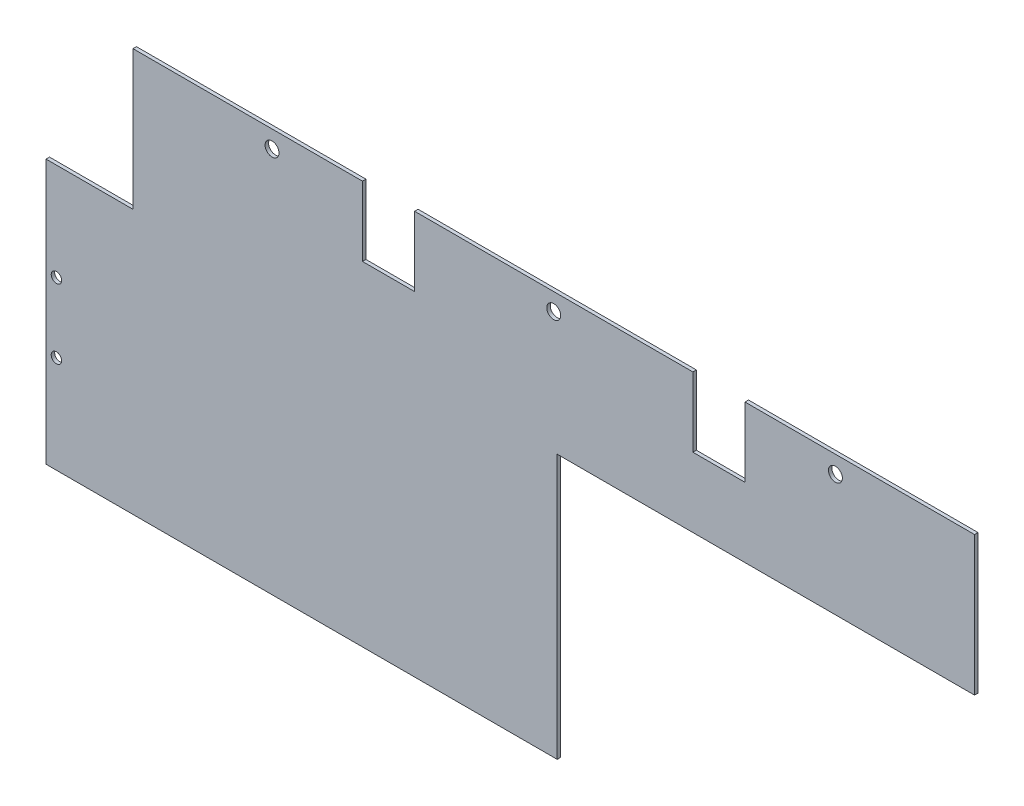
ISO-10303-21;
HEADER;
FILE_DESCRIPTION(('STEP AP214'),'2;1');
FILE_NAME('part.step','',(''),(''),'','','');
FILE_SCHEMA(('AUTOMOTIVE_DESIGN { 1 0 10303 214 1 1 1 1 }'));
ENDSEC;
DATA;
#1=APPLICATION_CONTEXT('core data for automotive mechanical design processes');
#2=APPLICATION_PROTOCOL_DEFINITION('international standard','automotive_design',2000,#1);
#3=PRODUCT_CONTEXT('',#1,'mechanical');
#4=PRODUCT('Part','Part','',(#3));
#5=PRODUCT_RELATED_PRODUCT_CATEGORY('part','',(#4));
#6=PRODUCT_DEFINITION_FORMATION('','',#4);
#7=PRODUCT_DEFINITION_CONTEXT('part definition',#1,'design');
#8=PRODUCT_DEFINITION('design','',#6,#7);
#9=PRODUCT_DEFINITION_SHAPE('','',#8);
#10=(LENGTH_UNIT() NAMED_UNIT(*) SI_UNIT(.MILLI.,.METRE.));
#11=(NAMED_UNIT(*) PLANE_ANGLE_UNIT() SI_UNIT($,.RADIAN.));
#12=(NAMED_UNIT(*) SI_UNIT($,.STERADIAN.) SOLID_ANGLE_UNIT());
#13=UNCERTAINTY_MEASURE_WITH_UNIT(LENGTH_MEASURE(1.E-05),#10,'distance_accuracy_value','');
#14=(GEOMETRIC_REPRESENTATION_CONTEXT(3) GLOBAL_UNCERTAINTY_ASSIGNED_CONTEXT((#13)) GLOBAL_UNIT_ASSIGNED_CONTEXT((#10,
#11,#12)) REPRESENTATION_CONTEXT('',''));
#15=CARTESIAN_POINT('',(0.,0.,0.));
#16=DIRECTION('',(0.,0.,1.));
#17=DIRECTION('',(1.,0.,0.));
#18=AXIS2_PLACEMENT_3D('',#15,#16,#17);
#19=CARTESIAN_POINT('',(25.,116.,1.));
#20=DIRECTION('',(0.,-1.,0.));
#21=DIRECTION('',(0.,0.,-1.));
#22=AXIS2_PLACEMENT_3D('',#19,#20,#21);
#23=PLANE('',#22);
#24=DIRECTION('',(-1.,0.,0.));
#25=VECTOR('',#24,1.);
#26=CARTESIAN_POINT('',(25.,116.,0.));
#27=LINE('',#26,#25);
#28=CARTESIAN_POINT('',(267.,116.,0.));
#29=VERTEX_POINT('',#28);
#30=CARTESIAN_POINT('',(201.,116.,0.));
#31=VERTEX_POINT('',#30);
#32=EDGE_CURVE('E282',#29,#31,#27,.T.);
#33=ORIENTED_EDGE('',*,*,#32,.T.);
#34=DIRECTION('',(0.,0.,1.));
#35=VECTOR('',#34,1.);
#36=CARTESIAN_POINT('',(201.,116.,0.));
#37=LINE('',#36,#35);
#38=CARTESIAN_POINT('',(201.,116.,1.));
#39=VERTEX_POINT('',#38);
#40=EDGE_CURVE('E212',#31,#39,#37,.T.);
#41=ORIENTED_EDGE('',*,*,#40,.T.);
#42=DIRECTION('',(-1.,0.,0.));
#43=VECTOR('',#42,1.);
#44=CARTESIAN_POINT('',(25.,116.,1.));
#45=LINE('',#44,#43);
#46=CARTESIAN_POINT('',(267.,116.,1.));
#47=VERTEX_POINT('',#46);
#48=EDGE_CURVE('E268',#47,#39,#45,.T.);
#49=ORIENTED_EDGE('',*,*,#48,.F.);
#50=DIRECTION('',(0.,0.,-1.));
#51=VECTOR('',#50,1.);
#52=CARTESIAN_POINT('',(267.,116.,1.));
#53=LINE('',#52,#51);
#54=EDGE_CURVE('E48',#47,#29,#53,.T.);
#55=ORIENTED_EDGE('',*,*,#54,.T.);
#56=EDGE_LOOP('',(#33,#41,#49,#55));
#57=FACE_BOUND('',#56,.T.);
#58=ADVANCED_FACE('F40',(#57),#23,.F.);
#59=CARTESIAN_POINT('',(91.,116.,1.));
#60=VERTEX_POINT('',#59);
#61=CARTESIAN_POINT('',(25.,116.,1.));
#62=VERTEX_POINT('',#61);
#63=EDGE_CURVE('E267',#60,#62,#45,.T.);
#64=ORIENTED_EDGE('',*,*,#63,.F.);
#65=DIRECTION('',(0.,0.,1.));
#66=VECTOR('',#65,1.);
#67=CARTESIAN_POINT('',(91.,116.,0.));
#68=LINE('',#67,#66);
#69=CARTESIAN_POINT('',(91.,116.,0.));
#70=VERTEX_POINT('',#69);
#71=EDGE_CURVE('E241',#70,#60,#68,.T.);
#72=ORIENTED_EDGE('',*,*,#71,.F.);
#73=CARTESIAN_POINT('',(25.,116.,0.));
#74=VERTEX_POINT('',#73);
#75=EDGE_CURVE('E281',#70,#74,#27,.T.);
#76=ORIENTED_EDGE('',*,*,#75,.T.);
#77=DIRECTION('',(0.,0.,-1.));
#78=VECTOR('',#77,1.);
#79=CARTESIAN_POINT('',(25.,116.,1.));
#80=LINE('',#79,#78);
#81=EDGE_CURVE('E299',#62,#74,#80,.T.);
#82=ORIENTED_EDGE('',*,*,#81,.F.);
#83=EDGE_LOOP('',(#64,#72,#76,#82));
#84=FACE_BOUND('',#83,.T.);
#85=ADVANCED_FACE('F327',(#84),#23,.F.);
#86=CARTESIAN_POINT('',(0.,0.,1.));
#87=DIRECTION('',(0.,0.,-1.));
#88=DIRECTION('',(-1.,0.,0.));
#89=AXIS2_PLACEMENT_3D('',#86,#87,#88);
#90=PLANE('',#89);
#91=CARTESIAN_POINT('',(65.,111.,1.));
#92=DIRECTION('',(0.,0.,1.));
#93=DIRECTION('',(1.,0.,0.));
#94=AXIS2_PLACEMENT_3D('',#91,#92,#93);
#95=CIRCLE('',#94,2.);
#96=CARTESIAN_POINT('',(67.,111.,1.));
#97=VERTEX_POINT('',#96);
#98=EDGE_CURVE('E186',#97,#97,#95,.T.);
#99=ORIENTED_EDGE('',*,*,#98,.F.);
#100=EDGE_LOOP('',(#99));
#101=FACE_BOUND('',#100,.T.);
#102=CARTESIAN_POINT('',(227.,111.,1.));
#103=DIRECTION('',(0.,0.,1.));
#104=DIRECTION('',(-1.,0.,0.));
#105=AXIS2_PLACEMENT_3D('',#102,#103,#104);
#106=CIRCLE('',#105,2.);
#107=CARTESIAN_POINT('',(225.,111.,1.));
#108=VERTEX_POINT('',#107);
#109=EDGE_CURVE('E187',#108,#108,#106,.T.);
#110=ORIENTED_EDGE('',*,*,#109,.F.);
#111=EDGE_LOOP('',(#110));
#112=FACE_BOUND('',#111,.T.);
#113=CARTESIAN_POINT('',(146.,111.,1.));
#114=DIRECTION('',(0.,0.,1.));
#115=DIRECTION('',(1.,0.,0.));
#116=AXIS2_PLACEMENT_3D('',#113,#114,#115);
#117=CIRCLE('',#116,2.);
#118=CARTESIAN_POINT('',(148.,111.,1.));
#119=VERTEX_POINT('',#118);
#120=EDGE_CURVE('E181',#119,#119,#117,.T.);
#121=ORIENTED_EDGE('',*,*,#120,.F.);
#122=EDGE_LOOP('',(#121));
#123=FACE_BOUND('',#122,.T.);
#124=DIRECTION('',(1.,0.,0.));
#125=VECTOR('',#124,1.);
#126=CARTESIAN_POINT('',(292.,0.,1.));
#127=LINE('',#126,#125);
#128=CARTESIAN_POINT('',(0.,0.,1.));
#129=VERTEX_POINT('',#128);
#130=CARTESIAN_POINT('',(147.,0.,1.));
#131=VERTEX_POINT('',#130);
#132=EDGE_CURVE('E261',#129,#131,#127,.T.);
#133=ORIENTED_EDGE('',*,*,#132,.T.);
#134=DIRECTION('',(0.,-1.,0.));
#135=VECTOR('',#134,1.);
#136=CARTESIAN_POINT('',(147.,0.,1.));
#137=LINE('',#136,#135);
#138=CARTESIAN_POINT('',(147.,76.,1.));
#139=VERTEX_POINT('',#138);
#140=EDGE_CURVE('E176',#139,#131,#137,.T.);
#141=ORIENTED_EDGE('',*,*,#140,.F.);
#142=DIRECTION('',(-1.,0.,0.));
#143=VECTOR('',#142,1.);
#144=CARTESIAN_POINT('',(292.,76.,1.));
#145=LINE('',#144,#143);
#146=CARTESIAN_POINT('',(267.,76.,1.));
#147=VERTEX_POINT('',#146);
#148=EDGE_CURVE('E158',#147,#139,#145,.T.);
#149=ORIENTED_EDGE('',*,*,#148,.F.);
#150=DIRECTION('',(0.,1.,0.));
#151=VECTOR('',#150,1.);
#152=CARTESIAN_POINT('',(267.,116.,1.));
#153=LINE('',#152,#151);
#154=EDGE_CURVE('E264',#147,#47,#153,.T.);
#155=ORIENTED_EDGE('',*,*,#154,.T.);
#156=ORIENTED_EDGE('',*,*,#48,.T.);
#157=DIRECTION('',(0.,1.,0.));
#158=VECTOR('',#157,1.);
#159=CARTESIAN_POINT('',(201.,116.,1.));
#160=LINE('',#159,#158);
#161=CARTESIAN_POINT('',(201.,96.,1.));
#162=VERTEX_POINT('',#161);
#163=EDGE_CURVE('E197',#162,#39,#160,.T.);
#164=ORIENTED_EDGE('',*,*,#163,.F.);
#165=DIRECTION('',(1.,0.,0.));
#166=VECTOR('',#165,1.);
#167=CARTESIAN_POINT('',(201.,96.,1.));
#168=LINE('',#167,#166);
#169=CARTESIAN_POINT('',(186.,96.,1.));
#170=VERTEX_POINT('',#169);
#171=EDGE_CURVE('E207',#170,#162,#168,.T.);
#172=ORIENTED_EDGE('',*,*,#171,.F.);
#173=DIRECTION('',(0.,-1.,0.));
#174=VECTOR('',#173,1.);
#175=CARTESIAN_POINT('',(186.,116.,1.));
#176=LINE('',#175,#174);
#177=CARTESIAN_POINT('',(186.,116.,1.));
#178=VERTEX_POINT('',#177);
#179=EDGE_CURVE('E204',#178,#170,#176,.T.);
#180=ORIENTED_EDGE('',*,*,#179,.F.);
#181=CARTESIAN_POINT('',(106.,116.,1.));
#182=VERTEX_POINT('',#181);
#183=EDGE_CURVE('E272',#178,#182,#45,.T.);
#184=ORIENTED_EDGE('',*,*,#183,.T.);
#185=DIRECTION('',(0.,1.,0.));
#186=VECTOR('',#185,1.);
#187=CARTESIAN_POINT('',(106.,116.,1.));
#188=LINE('',#187,#186);
#189=CARTESIAN_POINT('',(106.,96.,1.));
#190=VERTEX_POINT('',#189);
#191=EDGE_CURVE('E55',#190,#182,#188,.T.);
#192=ORIENTED_EDGE('',*,*,#191,.F.);
#193=DIRECTION('',(1.,0.,0.));
#194=VECTOR('',#193,1.);
#195=CARTESIAN_POINT('',(91.,96.,1.));
#196=LINE('',#195,#194);
#197=CARTESIAN_POINT('',(91.,96.,1.));
#198=VERTEX_POINT('',#197);
#199=EDGE_CURVE('E237',#198,#190,#196,.T.);
#200=ORIENTED_EDGE('',*,*,#199,.F.);
#201=DIRECTION('',(0.,-1.,0.));
#202=VECTOR('',#201,1.);
#203=CARTESIAN_POINT('',(91.,116.,1.));
#204=LINE('',#203,#202);
#205=EDGE_CURVE('E215',#60,#198,#204,.T.);
#206=ORIENTED_EDGE('',*,*,#205,.F.);
#207=ORIENTED_EDGE('',*,*,#63,.T.);
#208=DIRECTION('',(0.,-1.,0.));
#209=VECTOR('',#208,1.);
#210=CARTESIAN_POINT('',(25.,76.,1.));
#211=LINE('',#210,#209);
#212=CARTESIAN_POINT('',(25.,76.,1.));
#213=VERTEX_POINT('',#212);
#214=EDGE_CURVE('E271',#62,#213,#211,.T.);
#215=ORIENTED_EDGE('',*,*,#214,.T.);
#216=DIRECTION('',(-1.,0.,0.));
#217=VECTOR('',#216,1.);
#218=CARTESIAN_POINT('',(0.,76.,1.));
#219=LINE('',#218,#217);
#220=CARTESIAN_POINT('',(0.,76.,1.));
#221=VERTEX_POINT('',#220);
#222=EDGE_CURVE('E274',#213,#221,#219,.T.);
#223=ORIENTED_EDGE('',*,*,#222,.T.);
#224=DIRECTION('',(0.,-1.,0.));
#225=VECTOR('',#224,1.);
#226=CARTESIAN_POINT('',(0.,0.,1.));
#227=LINE('',#226,#225);
#228=EDGE_CURVE('E276',#221,#129,#227,.T.);
#229=ORIENTED_EDGE('',*,*,#228,.T.);
#230=EDGE_LOOP('',(#133,#141,#149,#155,#156,#164,#172,#180,#184,#192,#200,#206,#207,#215,#223,#229));
#231=FACE_BOUND('',#230,.T.);
#232=CARTESIAN_POINT('',(3.,48.,1.));
#233=DIRECTION('',(0.,0.,1.));
#234=DIRECTION('',(1.,0.,0.));
#235=AXIS2_PLACEMENT_3D('',#232,#233,#234);
#236=CIRCLE('',#235,1.5);
#237=CARTESIAN_POINT('',(4.5,48.,1.));
#238=VERTEX_POINT('',#237);
#239=EDGE_CURVE('E255',#238,#238,#236,.T.);
#240=ORIENTED_EDGE('',*,*,#239,.F.);
#241=EDGE_LOOP('',(#240));
#242=FACE_BOUND('',#241,.T.);
#243=CARTESIAN_POINT('',(3.,28.,1.));
#244=DIRECTION('',(0.,0.,1.));
#245=DIRECTION('',(1.,0.,0.));
#246=AXIS2_PLACEMENT_3D('',#243,#244,#245);
#247=CIRCLE('',#246,1.5);
#248=CARTESIAN_POINT('',(4.5,28.,1.));
#249=VERTEX_POINT('',#248);
#250=EDGE_CURVE('E249',#249,#249,#247,.T.);
#251=ORIENTED_EDGE('',*,*,#250,.F.);
#252=EDGE_LOOP('',(#251));
#253=FACE_BOUND('',#252,.T.);
#254=ADVANCED_FACE('F313',(#101,#112,#123,#231,#242,#253),#90,.F.);
#255=CARTESIAN_POINT('',(0.,0.,0.));
#256=DIRECTION('',(0.,0.,-1.));
#257=DIRECTION('',(-1.,0.,0.));
#258=AXIS2_PLACEMENT_3D('',#255,#256,#257);
#259=PLANE('',#258);
#260=DIRECTION('',(0.,-1.,0.));
#261=VECTOR('',#260,1.);
#262=CARTESIAN_POINT('',(147.,0.,0.));
#263=LINE('',#262,#261);
#264=CARTESIAN_POINT('',(147.,76.,0.));
#265=VERTEX_POINT('',#264);
#266=CARTESIAN_POINT('',(147.,0.,0.));
#267=VERTEX_POINT('',#266);
#268=EDGE_CURVE('E162',#265,#267,#263,.T.);
#269=ORIENTED_EDGE('',*,*,#268,.T.);
#270=DIRECTION('',(1.,0.,0.));
#271=VECTOR('',#270,1.);
#272=CARTESIAN_POINT('',(292.,0.,0.));
#273=LINE('',#272,#271);
#274=CARTESIAN_POINT('',(0.,0.,0.));
#275=VERTEX_POINT('',#274);
#276=EDGE_CURVE('E258',#275,#267,#273,.T.);
#277=ORIENTED_EDGE('',*,*,#276,.F.);
#278=DIRECTION('',(0.,-1.,0.));
#279=VECTOR('',#278,1.);
#280=CARTESIAN_POINT('',(0.,0.,0.));
#281=LINE('',#280,#279);
#282=CARTESIAN_POINT('',(0.,76.,0.));
#283=VERTEX_POINT('',#282);
#284=EDGE_CURVE('E265',#283,#275,#281,.T.);
#285=ORIENTED_EDGE('',*,*,#284,.F.);
#286=DIRECTION('',(-1.,0.,0.));
#287=VECTOR('',#286,1.);
#288=CARTESIAN_POINT('',(0.,76.,0.));
#289=LINE('',#288,#287);
#290=CARTESIAN_POINT('',(25.,76.,0.));
#291=VERTEX_POINT('',#290);
#292=EDGE_CURVE('E288',#291,#283,#289,.T.);
#293=ORIENTED_EDGE('',*,*,#292,.F.);
#294=DIRECTION('',(0.,-1.,0.));
#295=VECTOR('',#294,1.);
#296=CARTESIAN_POINT('',(25.,76.,0.));
#297=LINE('',#296,#295);
#298=EDGE_CURVE('E285',#74,#291,#297,.T.);
#299=ORIENTED_EDGE('',*,*,#298,.F.);
#300=ORIENTED_EDGE('',*,*,#75,.F.);
#301=DIRECTION('',(0.,-1.,0.));
#302=VECTOR('',#301,1.);
#303=CARTESIAN_POINT('',(91.,116.,0.));
#304=LINE('',#303,#302);
#305=CARTESIAN_POINT('',(91.,96.,0.));
#306=VERTEX_POINT('',#305);
#307=EDGE_CURVE('E225',#70,#306,#304,.T.);
#308=ORIENTED_EDGE('',*,*,#307,.T.);
#309=DIRECTION('',(1.,0.,0.));
#310=VECTOR('',#309,1.);
#311=CARTESIAN_POINT('',(91.,96.,0.));
#312=LINE('',#311,#310);
#313=CARTESIAN_POINT('',(106.,96.,0.));
#314=VERTEX_POINT('',#313);
#315=EDGE_CURVE('E228',#306,#314,#312,.T.);
#316=ORIENTED_EDGE('',*,*,#315,.T.);
#317=DIRECTION('',(0.,1.,0.));
#318=VECTOR('',#317,1.);
#319=CARTESIAN_POINT('',(106.,116.,0.));
#320=LINE('',#319,#318);
#321=CARTESIAN_POINT('',(106.,116.,0.));
#322=VERTEX_POINT('',#321);
#323=EDGE_CURVE('E231',#314,#322,#320,.T.);
#324=ORIENTED_EDGE('',*,*,#323,.T.);
#325=CARTESIAN_POINT('',(186.,116.,0.));
#326=VERTEX_POINT('',#325);
#327=EDGE_CURVE('E286',#326,#322,#27,.T.);
#328=ORIENTED_EDGE('',*,*,#327,.F.);
#329=DIRECTION('',(0.,-1.,0.));
#330=VECTOR('',#329,1.);
#331=CARTESIAN_POINT('',(186.,116.,0.));
#332=LINE('',#331,#330);
#333=CARTESIAN_POINT('',(186.,96.,0.));
#334=VERTEX_POINT('',#333);
#335=EDGE_CURVE('E63',#326,#334,#332,.T.);
#336=ORIENTED_EDGE('',*,*,#335,.T.);
#337=DIRECTION('',(1.,0.,0.));
#338=VECTOR('',#337,1.);
#339=CARTESIAN_POINT('',(201.,96.,0.));
#340=LINE('',#339,#338);
#341=CARTESIAN_POINT('',(201.,96.,0.));
#342=VERTEX_POINT('',#341);
#343=EDGE_CURVE('E196',#334,#342,#340,.T.);
#344=ORIENTED_EDGE('',*,*,#343,.T.);
#345=DIRECTION('',(0.,1.,0.));
#346=VECTOR('',#345,1.);
#347=CARTESIAN_POINT('',(201.,116.,0.));
#348=LINE('',#347,#346);
#349=EDGE_CURVE('E200',#342,#31,#348,.T.);
#350=ORIENTED_EDGE('',*,*,#349,.T.);
#351=ORIENTED_EDGE('',*,*,#32,.F.);
#352=DIRECTION('',(0.,1.,0.));
#353=VECTOR('',#352,1.);
#354=CARTESIAN_POINT('',(267.,116.,0.));
#355=LINE('',#354,#353);
#356=CARTESIAN_POINT('',(267.,76.,0.));
#357=VERTEX_POINT('',#356);
#358=EDGE_CURVE('E175',#357,#29,#355,.T.);
#359=ORIENTED_EDGE('',*,*,#358,.F.);
#360=DIRECTION('',(-1.,0.,0.));
#361=VECTOR('',#360,1.);
#362=CARTESIAN_POINT('',(292.,76.,0.));
#363=LINE('',#362,#361);
#364=EDGE_CURVE('E156',#357,#265,#363,.T.);
#365=ORIENTED_EDGE('',*,*,#364,.T.);
#366=EDGE_LOOP('',(#269,#277,#285,#293,#299,#300,#308,#316,#324,#328,#336,#344,#350,#351,#359,#365));
#367=FACE_BOUND('',#366,.T.);
#368=CARTESIAN_POINT('',(65.,111.,0.));
#369=DIRECTION('',(0.,0.,1.));
#370=DIRECTION('',(1.,0.,0.));
#371=AXIS2_PLACEMENT_3D('',#368,#369,#370);
#372=CIRCLE('',#371,2.);
#373=CARTESIAN_POINT('',(67.,111.,0.));
#374=VERTEX_POINT('',#373);
#375=EDGE_CURVE('E208',#374,#374,#372,.T.);
#376=ORIENTED_EDGE('',*,*,#375,.T.);
#377=EDGE_LOOP('',(#376));
#378=FACE_BOUND('',#377,.T.);
#379=CARTESIAN_POINT('',(227.,111.,0.));
#380=DIRECTION('',(0.,0.,1.));
#381=DIRECTION('',(-1.,0.,0.));
#382=AXIS2_PLACEMENT_3D('',#379,#380,#381);
#383=CIRCLE('',#382,2.);
#384=CARTESIAN_POINT('',(225.,111.,0.));
#385=VERTEX_POINT('',#384);
#386=EDGE_CURVE('E183',#385,#385,#383,.T.);
#387=ORIENTED_EDGE('',*,*,#386,.T.);
#388=EDGE_LOOP('',(#387));
#389=FACE_BOUND('',#388,.T.);
#390=CARTESIAN_POINT('',(146.,111.,0.));
#391=DIRECTION('',(0.,0.,1.));
#392=DIRECTION('',(1.,0.,0.));
#393=AXIS2_PLACEMENT_3D('',#390,#391,#392);
#394=CIRCLE('',#393,2.);
#395=CARTESIAN_POINT('',(148.,111.,0.));
#396=VERTEX_POINT('',#395);
#397=EDGE_CURVE('E190',#396,#396,#394,.T.);
#398=ORIENTED_EDGE('',*,*,#397,.T.);
#399=EDGE_LOOP('',(#398));
#400=FACE_BOUND('',#399,.T.);
#401=CARTESIAN_POINT('',(3.,48.,0.));
#402=DIRECTION('',(0.,0.,1.));
#403=DIRECTION('',(1.,0.,0.));
#404=AXIS2_PLACEMENT_3D('',#401,#402,#403);
#405=CIRCLE('',#404,1.5);
#406=CARTESIAN_POINT('',(4.5,48.,0.));
#407=VERTEX_POINT('',#406);
#408=EDGE_CURVE('E252',#407,#407,#405,.T.);
#409=ORIENTED_EDGE('',*,*,#408,.T.);
#410=EDGE_LOOP('',(#409));
#411=FACE_BOUND('',#410,.T.);
#412=CARTESIAN_POINT('',(3.,28.,0.));
#413=DIRECTION('',(0.,0.,1.));
#414=DIRECTION('',(1.,0.,0.));
#415=AXIS2_PLACEMENT_3D('',#412,#413,#414);
#416=CIRCLE('',#415,1.5);
#417=CARTESIAN_POINT('',(4.5,28.,0.));
#418=VERTEX_POINT('',#417);
#419=EDGE_CURVE('E243',#418,#418,#416,.T.);
#420=ORIENTED_EDGE('',*,*,#419,.T.);
#421=EDGE_LOOP('',(#420));
#422=FACE_BOUND('',#421,.T.);
#423=ADVANCED_FACE('F172',(#367,#378,#389,#400,#411,#422),#259,.T.);
#424=CARTESIAN_POINT('',(292.,0.,1.));
#425=DIRECTION('',(0.,1.,0.));
#426=DIRECTION('',(0.,0.,1.));
#427=AXIS2_PLACEMENT_3D('',#424,#425,#426);
#428=PLANE('',#427);
#429=ORIENTED_EDGE('',*,*,#276,.T.);
#430=DIRECTION('',(0.,0.,1.));
#431=VECTOR('',#430,1.);
#432=CARTESIAN_POINT('',(147.,0.,0.));
#433=LINE('',#432,#431);
#434=EDGE_CURVE('E161',#267,#131,#433,.T.);
#435=ORIENTED_EDGE('',*,*,#434,.T.);
#436=ORIENTED_EDGE('',*,*,#132,.F.);
#437=DIRECTION('',(0.,0.,-1.));
#438=VECTOR('',#437,1.);
#439=CARTESIAN_POINT('',(0.,0.,1.));
#440=LINE('',#439,#438);
#441=EDGE_CURVE('E278',#129,#275,#440,.T.);
#442=ORIENTED_EDGE('',*,*,#441,.T.);
#443=EDGE_LOOP('',(#429,#435,#436,#442));
#444=FACE_BOUND('',#443,.T.);
#445=ADVANCED_FACE('F42',(#444),#428,.F.);
#446=CARTESIAN_POINT('',(267.,116.,1.));
#447=DIRECTION('',(-1.,0.,0.));
#448=DIRECTION('',(0.,0.,1.));
#449=AXIS2_PLACEMENT_3D('',#446,#447,#448);
#450=PLANE('',#449);
#451=ORIENTED_EDGE('',*,*,#358,.T.);
#452=ORIENTED_EDGE('',*,*,#54,.F.);
#453=ORIENTED_EDGE('',*,*,#154,.F.);
#454=DIRECTION('',(0.,0.,-1.));
#455=VECTOR('',#454,1.);
#456=CARTESIAN_POINT('',(267.,76.,1.));
#457=LINE('',#456,#455);
#458=EDGE_CURVE('E11',#147,#357,#457,.T.);
#459=ORIENTED_EDGE('',*,*,#458,.T.);
#460=EDGE_LOOP('',(#451,#452,#453,#459));
#461=FACE_BOUND('',#460,.T.);
#462=ADVANCED_FACE('F316',(#461),#450,.F.);
#463=ORIENTED_EDGE('',*,*,#183,.F.);
#464=DIRECTION('',(0.,0.,1.));
#465=VECTOR('',#464,1.);
#466=CARTESIAN_POINT('',(186.,116.,0.));
#467=LINE('',#466,#465);
#468=EDGE_CURVE('E203',#326,#178,#467,.T.);
#469=ORIENTED_EDGE('',*,*,#468,.F.);
#470=ORIENTED_EDGE('',*,*,#327,.T.);
#471=DIRECTION('',(0.,0.,1.));
#472=VECTOR('',#471,1.);
#473=CARTESIAN_POINT('',(106.,116.,0.));
#474=LINE('',#473,#472);
#475=EDGE_CURVE('E244',#322,#182,#474,.T.);
#476=ORIENTED_EDGE('',*,*,#475,.T.);
#477=EDGE_LOOP('',(#463,#469,#470,#476));
#478=FACE_BOUND('',#477,.T.);
#479=ADVANCED_FACE('F318',(#478),#23,.F.);
#480=CARTESIAN_POINT('',(25.,76.,1.));
#481=DIRECTION('',(1.,0.,0.));
#482=DIRECTION('',(0.,0.,-1.));
#483=AXIS2_PLACEMENT_3D('',#480,#481,#482);
#484=PLANE('',#483);
#485=ORIENTED_EDGE('',*,*,#298,.T.);
#486=DIRECTION('',(0.,0.,-1.));
#487=VECTOR('',#486,1.);
#488=CARTESIAN_POINT('',(25.,76.,1.));
#489=LINE('',#488,#487);
#490=EDGE_CURVE('E296',#213,#291,#489,.T.);
#491=ORIENTED_EDGE('',*,*,#490,.F.);
#492=ORIENTED_EDGE('',*,*,#214,.F.);
#493=ORIENTED_EDGE('',*,*,#81,.T.);
#494=EDGE_LOOP('',(#485,#491,#492,#493));
#495=FACE_BOUND('',#494,.T.);
#496=ADVANCED_FACE('F324',(#495),#484,.F.);
#497=CARTESIAN_POINT('',(0.,76.,1.));
#498=DIRECTION('',(0.,-1.,0.));
#499=DIRECTION('',(1.,0.,0.));
#500=AXIS2_PLACEMENT_3D('',#497,#498,#499);
#501=PLANE('',#500);
#502=ORIENTED_EDGE('',*,*,#292,.T.);
#503=DIRECTION('',(0.,0.,-1.));
#504=VECTOR('',#503,1.);
#505=CARTESIAN_POINT('',(0.,76.,1.));
#506=LINE('',#505,#504);
#507=EDGE_CURVE('E293',#221,#283,#506,.T.);
#508=ORIENTED_EDGE('',*,*,#507,.F.);
#509=ORIENTED_EDGE('',*,*,#222,.F.);
#510=ORIENTED_EDGE('',*,*,#490,.T.);
#511=EDGE_LOOP('',(#502,#508,#509,#510));
#512=FACE_BOUND('',#511,.T.);
#513=ADVANCED_FACE('F338',(#512),#501,.F.);
#514=CARTESIAN_POINT('',(0.,0.,1.));
#515=DIRECTION('',(1.,0.,0.));
#516=DIRECTION('',(0.,0.,-1.));
#517=AXIS2_PLACEMENT_3D('',#514,#515,#516);
#518=PLANE('',#517);
#519=ORIENTED_EDGE('',*,*,#284,.T.);
#520=ORIENTED_EDGE('',*,*,#441,.F.);
#521=ORIENTED_EDGE('',*,*,#228,.F.);
#522=ORIENTED_EDGE('',*,*,#507,.T.);
#523=EDGE_LOOP('',(#519,#520,#521,#522));
#524=FACE_BOUND('',#523,.T.);
#525=ADVANCED_FACE('F342',(#524),#518,.F.);
#526=CARTESIAN_POINT('',(3.,48.,1.));
#527=DIRECTION('',(0.,0.,-1.));
#528=DIRECTION('',(-1.,0.,0.));
#529=AXIS2_PLACEMENT_3D('',#526,#527,#528);
#530=CYLINDRICAL_SURFACE('',#529,1.5);
#531=ORIENTED_EDGE('',*,*,#239,.T.);
#532=EDGE_LOOP('',(#531));
#533=FACE_BOUND('',#532,.T.);
#534=ORIENTED_EDGE('',*,*,#408,.F.);
#535=EDGE_LOOP('',(#534));
#536=FACE_BOUND('',#535,.T.);
#537=ADVANCED_FACE('F346',(#533,#536),#530,.F.);
#538=CARTESIAN_POINT('',(3.,28.,1.));
#539=DIRECTION('',(0.,0.,-1.));
#540=DIRECTION('',(-1.,0.,0.));
#541=AXIS2_PLACEMENT_3D('',#538,#539,#540);
#542=CYLINDRICAL_SURFACE('',#541,1.5);
#543=ORIENTED_EDGE('',*,*,#250,.T.);
#544=EDGE_LOOP('',(#543));
#545=FACE_BOUND('',#544,.T.);
#546=ORIENTED_EDGE('',*,*,#419,.F.);
#547=EDGE_LOOP('',(#546));
#548=FACE_BOUND('',#547,.T.);
#549=ADVANCED_FACE('F355',(#545,#548),#542,.F.);
#550=CARTESIAN_POINT('',(91.,116.,0.));
#551=DIRECTION('',(-1.,0.,0.));
#552=DIRECTION('',(0.,0.,1.));
#553=AXIS2_PLACEMENT_3D('',#550,#551,#552);
#554=PLANE('',#553);
#555=ORIENTED_EDGE('',*,*,#205,.T.);
#556=DIRECTION('',(0.,0.,1.));
#557=VECTOR('',#556,1.);
#558=CARTESIAN_POINT('',(91.,96.,0.));
#559=LINE('',#558,#557);
#560=EDGE_CURVE('E234',#306,#198,#559,.T.);
#561=ORIENTED_EDGE('',*,*,#560,.F.);
#562=ORIENTED_EDGE('',*,*,#307,.F.);
#563=ORIENTED_EDGE('',*,*,#71,.T.);
#564=EDGE_LOOP('',(#555,#561,#562,#563));
#565=FACE_BOUND('',#564,.T.);
#566=ADVANCED_FACE('F359',(#565),#554,.F.);
#567=CARTESIAN_POINT('',(106.,116.,0.));
#568=DIRECTION('',(1.,0.,0.));
#569=DIRECTION('',(0.,1.,0.));
#570=AXIS2_PLACEMENT_3D('',#567,#568,#569);
#571=PLANE('',#570);
#572=ORIENTED_EDGE('',*,*,#191,.T.);
#573=ORIENTED_EDGE('',*,*,#475,.F.);
#574=ORIENTED_EDGE('',*,*,#323,.F.);
#575=DIRECTION('',(0.,0.,1.));
#576=VECTOR('',#575,1.);
#577=CARTESIAN_POINT('',(106.,96.,0.));
#578=LINE('',#577,#576);
#579=EDGE_CURVE('E246',#314,#190,#578,.T.);
#580=ORIENTED_EDGE('',*,*,#579,.T.);
#581=EDGE_LOOP('',(#572,#573,#574,#580));
#582=FACE_BOUND('',#581,.T.);
#583=ADVANCED_FACE('F363',(#582),#571,.F.);
#584=CARTESIAN_POINT('',(91.,96.,0.));
#585=DIRECTION('',(0.,-1.,0.));
#586=DIRECTION('',(0.,0.,-1.));
#587=AXIS2_PLACEMENT_3D('',#584,#585,#586);
#588=PLANE('',#587);
#589=ORIENTED_EDGE('',*,*,#199,.T.);
#590=ORIENTED_EDGE('',*,*,#579,.F.);
#591=ORIENTED_EDGE('',*,*,#315,.F.);
#592=ORIENTED_EDGE('',*,*,#560,.T.);
#593=EDGE_LOOP('',(#589,#590,#591,#592));
#594=FACE_BOUND('',#593,.T.);
#595=ADVANCED_FACE('F365',(#594),#588,.F.);
#596=CARTESIAN_POINT('',(201.,116.,0.));
#597=DIRECTION('',(1.,0.,0.));
#598=DIRECTION('',(0.,0.,-1.));
#599=AXIS2_PLACEMENT_3D('',#596,#597,#598);
#600=PLANE('',#599);
#601=ORIENTED_EDGE('',*,*,#163,.T.);
#602=ORIENTED_EDGE('',*,*,#40,.F.);
#603=ORIENTED_EDGE('',*,*,#349,.F.);
#604=DIRECTION('',(0.,0.,1.));
#605=VECTOR('',#604,1.);
#606=CARTESIAN_POINT('',(201.,96.,0.));
#607=LINE('',#606,#605);
#608=EDGE_CURVE('E216',#342,#162,#607,.T.);
#609=ORIENTED_EDGE('',*,*,#608,.T.);
#610=EDGE_LOOP('',(#601,#602,#603,#609));
#611=FACE_BOUND('',#610,.T.);
#612=ADVANCED_FACE('F310',(#611),#600,.F.);
#613=CARTESIAN_POINT('',(201.,96.,0.));
#614=DIRECTION('',(0.,-1.,0.));
#615=DIRECTION('',(0.,0.,-1.));
#616=AXIS2_PLACEMENT_3D('',#613,#614,#615);
#617=PLANE('',#616);
#618=ORIENTED_EDGE('',*,*,#171,.T.);
#619=ORIENTED_EDGE('',*,*,#608,.F.);
#620=ORIENTED_EDGE('',*,*,#343,.F.);
#621=DIRECTION('',(0.,0.,1.));
#622=VECTOR('',#621,1.);
#623=CARTESIAN_POINT('',(186.,96.,0.));
#624=LINE('',#623,#622);
#625=EDGE_CURVE('E218',#334,#170,#624,.T.);
#626=ORIENTED_EDGE('',*,*,#625,.T.);
#627=EDGE_LOOP('',(#618,#619,#620,#626));
#628=FACE_BOUND('',#627,.T.);
#629=ADVANCED_FACE('F380',(#628),#617,.F.);
#630=CARTESIAN_POINT('',(186.,116.,0.));
#631=DIRECTION('',(-1.,0.,0.));
#632=DIRECTION('',(0.,-1.,0.));
#633=AXIS2_PLACEMENT_3D('',#630,#631,#632);
#634=PLANE('',#633);
#635=ORIENTED_EDGE('',*,*,#179,.T.);
#636=ORIENTED_EDGE('',*,*,#625,.F.);
#637=ORIENTED_EDGE('',*,*,#335,.F.);
#638=ORIENTED_EDGE('',*,*,#468,.T.);
#639=EDGE_LOOP('',(#635,#636,#637,#638));
#640=FACE_BOUND('',#639,.T.);
#641=ADVANCED_FACE('F376',(#640),#634,.F.);
#642=CARTESIAN_POINT('',(146.,111.,0.));
#643=DIRECTION('',(0.,0.,1.));
#644=DIRECTION('',(1.,0.,0.));
#645=AXIS2_PLACEMENT_3D('',#642,#643,#644);
#646=CYLINDRICAL_SURFACE('',#645,2.);
#647=ORIENTED_EDGE('',*,*,#397,.F.);
#648=EDGE_LOOP('',(#647));
#649=FACE_BOUND('',#648,.T.);
#650=ORIENTED_EDGE('',*,*,#120,.T.);
#651=EDGE_LOOP('',(#650));
#652=FACE_BOUND('',#651,.T.);
#653=ADVANCED_FACE('F379',(#649,#652),#646,.F.);
#654=CARTESIAN_POINT('',(227.,111.,0.));
#655=DIRECTION('',(0.,0.,1.));
#656=DIRECTION('',(1.,0.,0.));
#657=AXIS2_PLACEMENT_3D('',#654,#655,#656);
#658=CYLINDRICAL_SURFACE('',#657,2.);
#659=ORIENTED_EDGE('',*,*,#386,.F.);
#660=EDGE_LOOP('',(#659));
#661=FACE_BOUND('',#660,.T.);
#662=ORIENTED_EDGE('',*,*,#109,.T.);
#663=EDGE_LOOP('',(#662));
#664=FACE_BOUND('',#663,.T.);
#665=ADVANCED_FACE('F374',(#661,#664),#658,.F.);
#666=CARTESIAN_POINT('',(65.,111.,0.));
#667=DIRECTION('',(0.,0.,1.));
#668=DIRECTION('',(1.,0.,0.));
#669=AXIS2_PLACEMENT_3D('',#666,#667,#668);
#670=CYLINDRICAL_SURFACE('',#669,2.);
#671=ORIENTED_EDGE('',*,*,#375,.F.);
#672=EDGE_LOOP('',(#671));
#673=FACE_BOUND('',#672,.T.);
#674=ORIENTED_EDGE('',*,*,#98,.T.);
#675=EDGE_LOOP('',(#674));
#676=FACE_BOUND('',#675,.T.);
#677=ADVANCED_FACE('F371',(#673,#676),#670,.F.);
#678=CARTESIAN_POINT('',(292.,76.,0.));
#679=DIRECTION('',(0.,1.,0.));
#680=DIRECTION('',(-1.,0.,0.));
#681=AXIS2_PLACEMENT_3D('',#678,#679,#680);
#682=PLANE('',#681);
#683=ORIENTED_EDGE('',*,*,#148,.T.);
#684=DIRECTION('',(0.,0.,1.));
#685=VECTOR('',#684,1.);
#686=CARTESIAN_POINT('',(147.,76.,0.));
#687=LINE('',#686,#685);
#688=EDGE_CURVE('E152',#265,#139,#687,.T.);
#689=ORIENTED_EDGE('',*,*,#688,.F.);
#690=ORIENTED_EDGE('',*,*,#364,.F.);
#691=ORIENTED_EDGE('',*,*,#458,.F.);
#692=EDGE_LOOP('',(#683,#689,#690,#691));
#693=FACE_BOUND('',#692,.T.);
#694=ADVANCED_FACE('F154',(#693),#682,.F.);
#695=CARTESIAN_POINT('',(147.,0.,0.));
#696=DIRECTION('',(-1.,0.,0.));
#697=DIRECTION('',(0.,0.,1.));
#698=AXIS2_PLACEMENT_3D('',#695,#696,#697);
#699=PLANE('',#698);
#700=ORIENTED_EDGE('',*,*,#140,.T.);
#701=ORIENTED_EDGE('',*,*,#434,.F.);
#702=ORIENTED_EDGE('',*,*,#268,.F.);
#703=ORIENTED_EDGE('',*,*,#688,.T.);
#704=EDGE_LOOP('',(#700,#701,#702,#703));
#705=FACE_BOUND('',#704,.T.);
#706=ADVANCED_FACE('F165',(#705),#699,.F.);
#707=CLOSED_SHELL('',(#58,#85,#254,#423,#445,#462,#479,#496,#513,#525,#537,#549,#566,#583,#595,
#612,#629,#641,#653,#665,#677,#694,#706));
#708=MANIFOLD_SOLID_BREP('B2',#707);
#709=ADVANCED_BREP_SHAPE_REPRESENTATION('',(#18,#708),#14);
#710=SHAPE_DEFINITION_REPRESENTATION(#9,#709);
ENDSEC;
END-ISO-10303-21;
